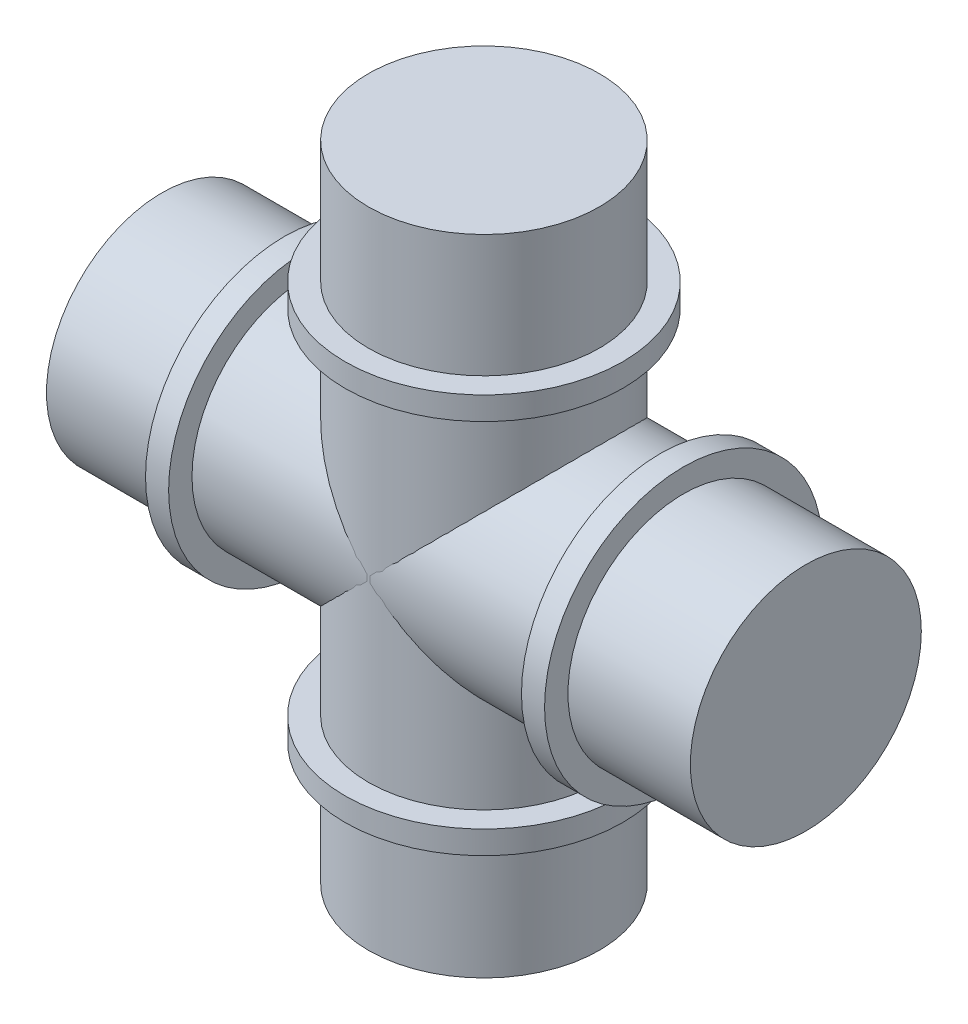
ISO-10303-21;
HEADER;
FILE_DESCRIPTION(('STEP AP214'),'2;1');
FILE_NAME('part.step','',(''),(''),'','','');
FILE_SCHEMA(('AUTOMOTIVE_DESIGN { 1 0 10303 214 1 1 1 1 }'));
ENDSEC;
DATA;
#1=APPLICATION_CONTEXT('core data for automotive mechanical design processes');
#2=APPLICATION_PROTOCOL_DEFINITION('international standard','automotive_design',2000,#1);
#3=PRODUCT_CONTEXT('',#1,'mechanical');
#4=PRODUCT('Part','Part','',(#3));
#5=PRODUCT_RELATED_PRODUCT_CATEGORY('part','',(#4));
#6=PRODUCT_DEFINITION_FORMATION('','',#4);
#7=PRODUCT_DEFINITION_CONTEXT('part definition',#1,'design');
#8=PRODUCT_DEFINITION('design','',#6,#7);
#9=PRODUCT_DEFINITION_SHAPE('','',#8);
#10=(LENGTH_UNIT() NAMED_UNIT(*) SI_UNIT(.MILLI.,.METRE.));
#11=(NAMED_UNIT(*) PLANE_ANGLE_UNIT() SI_UNIT($,.RADIAN.));
#12=(NAMED_UNIT(*) SI_UNIT($,.STERADIAN.) SOLID_ANGLE_UNIT());
#13=UNCERTAINTY_MEASURE_WITH_UNIT(LENGTH_MEASURE(1.E-05),#10,'distance_accuracy_value','');
#14=(GEOMETRIC_REPRESENTATION_CONTEXT(3) GLOBAL_UNCERTAINTY_ASSIGNED_CONTEXT((#13)) GLOBAL_UNIT_ASSIGNED_CONTEXT((#10,
#11,#12)) REPRESENTATION_CONTEXT('',''));
#15=CARTESIAN_POINT('',(0.,0.,0.));
#16=DIRECTION('',(0.,0.,1.));
#17=DIRECTION('',(1.,0.,0.));
#18=AXIS2_PLACEMENT_3D('',#15,#16,#17);
#19=CARTESIAN_POINT('',(-177.,127.,0.));
#20=DIRECTION('',(1.,0.,0.));
#21=DIRECTION('',(0.,0.,-1.));
#22=AXIS2_PLACEMENT_3D('',#19,#20,#21);
#23=CYLINDRICAL_SURFACE('',#22,63.5);
#24=CARTESIAN_POINT('',(97.,127.,0.));
#25=DIRECTION('',(1.,0.,0.));
#26=DIRECTION('',(0.,0.,-1.));
#27=AXIS2_PLACEMENT_3D('',#24,#25,#26);
#28=CIRCLE('',#27,63.5);
#29=CARTESIAN_POINT('',(97.,127.,-63.5));
#30=VERTEX_POINT('',#29);
#31=EDGE_CURVE('E68',#30,#30,#28,.T.);
#32=ORIENTED_EDGE('',*,*,#31,.F.);
#33=EDGE_LOOP('',(#32));
#34=FACE_BOUND('',#33,.T.);
#35=CARTESIAN_POINT('',(-97.,127.,0.));
#36=DIRECTION('',(-1.,0.,0.));
#37=DIRECTION('',(0.,0.,1.));
#38=AXIS2_PLACEMENT_3D('',#35,#36,#37);
#39=CIRCLE('',#38,63.5);
#40=CARTESIAN_POINT('',(-97.,127.,63.5));
#41=VERTEX_POINT('',#40);
#42=EDGE_CURVE('E77',#41,#41,#39,.T.);
#43=ORIENTED_EDGE('',*,*,#42,.F.);
#44=EDGE_LOOP('',(#43));
#45=FACE_BOUND('',#44,.T.);
#46=ADVANCED_FACE('F44',(#34,#45),#23,.T.);
#47=CARTESIAN_POINT('',(109.7,127.,0.));
#48=DIRECTION('',(1.,0.,0.));
#49=DIRECTION('',(0.,0.,-1.));
#50=AXIS2_PLACEMENT_3D('',#47,#48,#49);
#51=CIRCLE('',#50,63.5);
#52=CARTESIAN_POINT('',(109.7,127.,-63.5));
#53=VERTEX_POINT('',#52);
#54=EDGE_CURVE('E51',#53,#53,#51,.F.);
#55=ORIENTED_EDGE('',*,*,#54,.F.);
#56=EDGE_LOOP('',(#55));
#57=FACE_BOUND('',#56,.T.);
#58=CARTESIAN_POINT('',(177.,127.,0.));
#59=DIRECTION('',(1.,0.,0.));
#60=DIRECTION('',(0.,0.,-1.));
#61=AXIS2_PLACEMENT_3D('',#58,#59,#60);
#62=CIRCLE('',#61,63.5);
#63=CARTESIAN_POINT('',(177.,127.,-63.5));
#64=VERTEX_POINT('',#63);
#65=EDGE_CURVE('E59',#64,#64,#62,.T.);
#66=ORIENTED_EDGE('',*,*,#65,.F.);
#67=EDGE_LOOP('',(#66));
#68=FACE_BOUND('',#67,.T.);
#69=ADVANCED_FACE('F46',(#57,#68),#23,.T.);
#70=CARTESIAN_POINT('',(177.,0.,0.));
#71=DIRECTION('',(1.,0.,0.));
#72=DIRECTION('',(0.,0.,-1.));
#73=AXIS2_PLACEMENT_3D('',#70,#71,#72);
#74=PLANE('',#73);
#75=ORIENTED_EDGE('',*,*,#65,.T.);
#76=EDGE_LOOP('',(#75));
#77=FACE_BOUND('',#76,.T.);
#78=ADVANCED_FACE('F91',(#77),#74,.T.);
#79=CARTESIAN_POINT('',(109.7,127.,0.));
#80=DIRECTION('',(1.,0.,0.));
#81=DIRECTION('',(0.,0.,-1.));
#82=AXIS2_PLACEMENT_3D('',#79,#80,#81);
#83=PLANE('',#82);
#84=CARTESIAN_POINT('',(109.7,127.,0.));
#85=DIRECTION('',(1.,0.,0.));
#86=DIRECTION('',(0.,0.,-1.));
#87=AXIS2_PLACEMENT_3D('',#84,#85,#86);
#88=CIRCLE('',#87,76.35);
#89=CARTESIAN_POINT('',(109.7,127.,-76.35));
#90=VERTEX_POINT('',#89);
#91=EDGE_CURVE('E64',#90,#90,#88,.T.);
#92=ORIENTED_EDGE('',*,*,#91,.T.);
#93=EDGE_LOOP('',(#92));
#94=FACE_BOUND('',#93,.T.);
#95=ORIENTED_EDGE('',*,*,#54,.T.);
#96=EDGE_LOOP('',(#95));
#97=FACE_BOUND('',#96,.T.);
#98=ADVANCED_FACE('F112',(#94,#97),#83,.T.);
#99=CARTESIAN_POINT('',(97.,127.,0.));
#100=DIRECTION('',(1.,0.,0.));
#101=DIRECTION('',(0.,0.,-1.));
#102=AXIS2_PLACEMENT_3D('',#99,#100,#101);
#103=PLANE('',#102);
#104=CARTESIAN_POINT('',(97.,127.,0.));
#105=DIRECTION('',(1.,0.,0.));
#106=DIRECTION('',(0.,0.,-1.));
#107=AXIS2_PLACEMENT_3D('',#104,#105,#106);
#108=CIRCLE('',#107,76.35);
#109=CARTESIAN_POINT('',(97.,127.,-76.35));
#110=VERTEX_POINT('',#109);
#111=EDGE_CURVE('E65',#110,#110,#108,.T.);
#112=ORIENTED_EDGE('',*,*,#111,.F.);
#113=EDGE_LOOP('',(#112));
#114=FACE_BOUND('',#113,.T.);
#115=ORIENTED_EDGE('',*,*,#31,.T.);
#116=EDGE_LOOP('',(#115));
#117=FACE_BOUND('',#116,.T.);
#118=ADVANCED_FACE('F118',(#114,#117),#103,.F.);
#119=CARTESIAN_POINT('',(109.7,127.,0.));
#120=DIRECTION('',(-1.,0.,0.));
#121=DIRECTION('',(0.,0.,1.));
#122=AXIS2_PLACEMENT_3D('',#119,#120,#121);
#123=CYLINDRICAL_SURFACE('',#122,76.35);
#124=ORIENTED_EDGE('',*,*,#91,.F.);
#125=EDGE_LOOP('',(#124));
#126=FACE_BOUND('',#125,.T.);
#127=ORIENTED_EDGE('',*,*,#111,.T.);
#128=EDGE_LOOP('',(#127));
#129=FACE_BOUND('',#128,.T.);
#130=ADVANCED_FACE('F114',(#126,#129),#123,.T.);
#131=CARTESIAN_POINT('',(-109.7,127.,0.));
#132=DIRECTION('',(-1.,0.,0.));
#133=DIRECTION('',(0.,0.,1.));
#134=AXIS2_PLACEMENT_3D('',#131,#132,#133);
#135=PLANE('',#134);
#136=CARTESIAN_POINT('',(-109.7,127.,0.));
#137=DIRECTION('',(-1.,0.,0.));
#138=DIRECTION('',(0.,0.,1.));
#139=AXIS2_PLACEMENT_3D('',#136,#137,#138);
#140=CIRCLE('',#139,76.35);
#141=CARTESIAN_POINT('',(-109.7,127.,76.35));
#142=VERTEX_POINT('',#141);
#143=EDGE_CURVE('E73',#142,#142,#140,.T.);
#144=ORIENTED_EDGE('',*,*,#143,.T.);
#145=EDGE_LOOP('',(#144));
#146=FACE_BOUND('',#145,.T.);
#147=CARTESIAN_POINT('',(-109.7,127.,0.));
#148=DIRECTION('',(-1.,0.,0.));
#149=DIRECTION('',(0.,0.,1.));
#150=AXIS2_PLACEMENT_3D('',#147,#148,#149);
#151=CIRCLE('',#150,63.5);
#152=CARTESIAN_POINT('',(-109.7,127.,63.5));
#153=VERTEX_POINT('',#152);
#154=EDGE_CURVE('E11',#153,#153,#151,.F.);
#155=ORIENTED_EDGE('',*,*,#154,.T.);
#156=EDGE_LOOP('',(#155));
#157=FACE_BOUND('',#156,.T.);
#158=ADVANCED_FACE('F117',(#146,#157),#135,.T.);
#159=CARTESIAN_POINT('',(-97.,127.,0.));
#160=DIRECTION('',(-1.,0.,0.));
#161=DIRECTION('',(0.,0.,1.));
#162=AXIS2_PLACEMENT_3D('',#159,#160,#161);
#163=PLANE('',#162);
#164=CARTESIAN_POINT('',(-97.,127.,0.));
#165=DIRECTION('',(-1.,0.,0.));
#166=DIRECTION('',(0.,0.,1.));
#167=AXIS2_PLACEMENT_3D('',#164,#165,#166);
#168=CIRCLE('',#167,76.35);
#169=CARTESIAN_POINT('',(-97.,127.,76.35));
#170=VERTEX_POINT('',#169);
#171=EDGE_CURVE('E74',#170,#170,#168,.T.);
#172=ORIENTED_EDGE('',*,*,#171,.F.);
#173=EDGE_LOOP('',(#172));
#174=FACE_BOUND('',#173,.T.);
#175=ORIENTED_EDGE('',*,*,#42,.T.);
#176=EDGE_LOOP('',(#175));
#177=FACE_BOUND('',#176,.T.);
#178=ADVANCED_FACE('F83',(#174,#177),#163,.F.);
#179=CARTESIAN_POINT('',(-109.7,127.,0.));
#180=DIRECTION('',(1.,0.,0.));
#181=DIRECTION('',(0.,0.,-1.));
#182=AXIS2_PLACEMENT_3D('',#179,#180,#181);
#183=CYLINDRICAL_SURFACE('',#182,76.35);
#184=ORIENTED_EDGE('',*,*,#143,.F.);
#185=EDGE_LOOP('',(#184));
#186=FACE_BOUND('',#185,.T.);
#187=ORIENTED_EDGE('',*,*,#171,.T.);
#188=EDGE_LOOP('',(#187));
#189=FACE_BOUND('',#188,.T.);
#190=ADVANCED_FACE('F100',(#186,#189),#183,.T.);
#191=CARTESIAN_POINT('',(-177.,0.,0.));
#192=DIRECTION('',(1.,0.,0.));
#193=DIRECTION('',(0.,0.,-1.));
#194=AXIS2_PLACEMENT_3D('',#191,#192,#193);
#195=PLANE('',#194);
#196=CARTESIAN_POINT('',(-177.,127.,0.));
#197=DIRECTION('',(1.,0.,0.));
#198=DIRECTION('',(0.,0.,-1.));
#199=AXIS2_PLACEMENT_3D('',#196,#197,#198);
#200=CIRCLE('',#199,63.5);
#201=CARTESIAN_POINT('',(-177.,127.,-63.5));
#202=VERTEX_POINT('',#201);
#203=EDGE_CURVE('E55',#202,#202,#200,.T.);
#204=ORIENTED_EDGE('',*,*,#203,.F.);
#205=EDGE_LOOP('',(#204));
#206=FACE_BOUND('',#205,.T.);
#207=ADVANCED_FACE('F95',(#206),#195,.F.);
#208=ORIENTED_EDGE('',*,*,#154,.F.);
#209=EDGE_LOOP('',(#208));
#210=FACE_BOUND('',#209,.T.);
#211=ORIENTED_EDGE('',*,*,#203,.T.);
#212=EDGE_LOOP('',(#211));
#213=FACE_BOUND('',#212,.T.);
#214=ADVANCED_FACE('F87',(#210,#213),#23,.T.);
#215=CLOSED_SHELL('',(#46,#69,#78,#98,#118,#130,#158,#178,#190,#207,#214));
#216=MANIFOLD_SOLID_BREP('B2',#215);
#217=CARTESIAN_POINT('',(0.,-50.,0.));
#218=DIRECTION('',(0.,1.,0.));
#219=DIRECTION('',(0.,0.,1.));
#220=AXIS2_PLACEMENT_3D('',#217,#218,#219);
#221=CYLINDRICAL_SURFACE('',#220,63.5);
#222=CARTESIAN_POINT('',(0.,30.,0.));
#223=DIRECTION('',(0.,-1.,0.));
#224=DIRECTION('',(0.,0.,-1.));
#225=AXIS2_PLACEMENT_3D('',#222,#223,#224);
#226=CIRCLE('',#225,63.5);
#227=CARTESIAN_POINT('',(0.,30.,-63.5));
#228=VERTEX_POINT('',#227);
#229=EDGE_CURVE('E221',#228,#228,#226,.F.);
#230=ORIENTED_EDGE('',*,*,#229,.T.);
#231=EDGE_LOOP('',(#230));
#232=FACE_BOUND('',#231,.T.);
#233=CARTESIAN_POINT('',(0.,224.,0.));
#234=DIRECTION('',(0.,1.,0.));
#235=DIRECTION('',(0.,0.,1.));
#236=AXIS2_PLACEMENT_3D('',#233,#234,#235);
#237=CIRCLE('',#236,63.5);
#238=CARTESIAN_POINT('',(0.,224.,63.5));
#239=VERTEX_POINT('',#238);
#240=EDGE_CURVE('E222',#239,#239,#237,.F.);
#241=ORIENTED_EDGE('',*,*,#240,.T.);
#242=EDGE_LOOP('',(#241));
#243=FACE_BOUND('',#242,.T.);
#244=ADVANCED_FACE('F202',(#232,#243),#221,.T.);
#245=CARTESIAN_POINT('',(0.,17.3,0.));
#246=DIRECTION('',(0.,-1.,0.));
#247=DIRECTION('',(0.,0.,-1.));
#248=AXIS2_PLACEMENT_3D('',#245,#246,#247);
#249=CIRCLE('',#248,63.5);
#250=CARTESIAN_POINT('',(0.,17.3,-63.5));
#251=VERTEX_POINT('',#250);
#252=EDGE_CURVE('E209',#251,#251,#249,.F.);
#253=ORIENTED_EDGE('',*,*,#252,.F.);
#254=EDGE_LOOP('',(#253));
#255=FACE_BOUND('',#254,.T.);
#256=CARTESIAN_POINT('',(0.,-50.,0.));
#257=DIRECTION('',(0.,1.,0.));
#258=DIRECTION('',(0.,0.,1.));
#259=AXIS2_PLACEMENT_3D('',#256,#257,#258);
#260=CIRCLE('',#259,63.5);
#261=CARTESIAN_POINT('',(0.,-50.,63.5));
#262=VERTEX_POINT('',#261);
#263=EDGE_CURVE('E213',#262,#262,#260,.T.);
#264=ORIENTED_EDGE('',*,*,#263,.T.);
#265=EDGE_LOOP('',(#264));
#266=FACE_BOUND('',#265,.T.);
#267=ADVANCED_FACE('F204',(#255,#266),#221,.T.);
#268=CARTESIAN_POINT('',(0.,-50.,0.));
#269=DIRECTION('',(0.,1.,0.));
#270=DIRECTION('',(0.,0.,1.));
#271=AXIS2_PLACEMENT_3D('',#268,#269,#270);
#272=PLANE('',#271);
#273=ORIENTED_EDGE('',*,*,#263,.F.);
#274=EDGE_LOOP('',(#273));
#275=FACE_BOUND('',#274,.T.);
#276=ADVANCED_FACE('F258',(#275),#272,.F.);
#277=CARTESIAN_POINT('',(0.,17.3,0.));
#278=DIRECTION('',(0.,1.,0.));
#279=DIRECTION('',(0.,0.,1.));
#280=AXIS2_PLACEMENT_3D('',#277,#278,#279);
#281=CYLINDRICAL_SURFACE('',#280,76.35);
#282=CARTESIAN_POINT('',(0.,17.3,0.));
#283=DIRECTION('',(0.,-1.,0.));
#284=DIRECTION('',(0.,0.,-1.));
#285=AXIS2_PLACEMENT_3D('',#282,#283,#284);
#286=CIRCLE('',#285,76.35);
#287=CARTESIAN_POINT('',(0.,17.3,-76.35));
#288=VERTEX_POINT('',#287);
#289=EDGE_CURVE('E229',#288,#288,#286,.T.);
#290=ORIENTED_EDGE('',*,*,#289,.F.);
#291=EDGE_LOOP('',(#290));
#292=FACE_BOUND('',#291,.T.);
#293=CARTESIAN_POINT('',(0.,30.,0.));
#294=DIRECTION('',(0.,-1.,0.));
#295=DIRECTION('',(0.,0.,-1.));
#296=AXIS2_PLACEMENT_3D('',#293,#294,#295);
#297=CIRCLE('',#296,76.35);
#298=CARTESIAN_POINT('',(0.,30.,-76.35));
#299=VERTEX_POINT('',#298);
#300=EDGE_CURVE('E224',#299,#299,#297,.T.);
#301=ORIENTED_EDGE('',*,*,#300,.T.);
#302=EDGE_LOOP('',(#301));
#303=FACE_BOUND('',#302,.T.);
#304=ADVANCED_FACE('F256',(#292,#303),#281,.T.);
#305=CARTESIAN_POINT('',(0.,17.3,0.));
#306=DIRECTION('',(0.,-1.,0.));
#307=DIRECTION('',(0.,0.,-1.));
#308=AXIS2_PLACEMENT_3D('',#305,#306,#307);
#309=PLANE('',#308);
#310=ORIENTED_EDGE('',*,*,#252,.T.);
#311=EDGE_LOOP('',(#310));
#312=FACE_BOUND('',#311,.T.);
#313=ORIENTED_EDGE('',*,*,#289,.T.);
#314=EDGE_LOOP('',(#313));
#315=FACE_BOUND('',#314,.T.);
#316=ADVANCED_FACE('F252',(#312,#315),#309,.T.);
#317=CARTESIAN_POINT('',(0.,30.,0.));
#318=DIRECTION('',(0.,-1.,0.));
#319=DIRECTION('',(0.,0.,-1.));
#320=AXIS2_PLACEMENT_3D('',#317,#318,#319);
#321=PLANE('',#320);
#322=ORIENTED_EDGE('',*,*,#229,.F.);
#323=EDGE_LOOP('',(#322));
#324=FACE_BOUND('',#323,.T.);
#325=ORIENTED_EDGE('',*,*,#300,.F.);
#326=EDGE_LOOP('',(#325));
#327=FACE_BOUND('',#326,.T.);
#328=ADVANCED_FACE('F248',(#324,#327),#321,.F.);
#329=CARTESIAN_POINT('',(0.,236.7,0.));
#330=DIRECTION('',(0.,-1.,0.));
#331=DIRECTION('',(0.,0.,-1.));
#332=AXIS2_PLACEMENT_3D('',#329,#330,#331);
#333=CYLINDRICAL_SURFACE('',#332,76.35);
#334=CARTESIAN_POINT('',(0.,236.7,0.));
#335=DIRECTION('',(0.,1.,0.));
#336=DIRECTION('',(0.,0.,1.));
#337=AXIS2_PLACEMENT_3D('',#334,#335,#336);
#338=CIRCLE('',#337,76.35);
#339=CARTESIAN_POINT('',(0.,236.7,76.35));
#340=VERTEX_POINT('',#339);
#341=EDGE_CURVE('E225',#340,#340,#338,.T.);
#342=ORIENTED_EDGE('',*,*,#341,.F.);
#343=EDGE_LOOP('',(#342));
#344=FACE_BOUND('',#343,.T.);
#345=CARTESIAN_POINT('',(0.,224.,0.));
#346=DIRECTION('',(0.,1.,0.));
#347=DIRECTION('',(0.,0.,1.));
#348=AXIS2_PLACEMENT_3D('',#345,#346,#347);
#349=CIRCLE('',#348,76.35);
#350=CARTESIAN_POINT('',(0.,224.,76.35));
#351=VERTEX_POINT('',#350);
#352=EDGE_CURVE('E232',#351,#351,#349,.T.);
#353=ORIENTED_EDGE('',*,*,#352,.T.);
#354=EDGE_LOOP('',(#353));
#355=FACE_BOUND('',#354,.T.);
#356=ADVANCED_FACE('F251',(#344,#355),#333,.T.);
#357=CARTESIAN_POINT('',(0.,236.7,0.));
#358=DIRECTION('',(0.,1.,0.));
#359=DIRECTION('',(0.,0.,1.));
#360=AXIS2_PLACEMENT_3D('',#357,#358,#359);
#361=PLANE('',#360);
#362=CARTESIAN_POINT('',(0.,236.7,0.));
#363=DIRECTION('',(0.,1.,0.));
#364=DIRECTION('',(0.,0.,1.));
#365=AXIS2_PLACEMENT_3D('',#362,#363,#364);
#366=CIRCLE('',#365,63.5);
#367=CARTESIAN_POINT('',(0.,236.7,63.5));
#368=VERTEX_POINT('',#367);
#369=EDGE_CURVE('E43',#368,#368,#366,.F.);
#370=ORIENTED_EDGE('',*,*,#369,.T.);
#371=EDGE_LOOP('',(#370));
#372=FACE_BOUND('',#371,.T.);
#373=ORIENTED_EDGE('',*,*,#341,.T.);
#374=EDGE_LOOP('',(#373));
#375=FACE_BOUND('',#374,.T.);
#376=ADVANCED_FACE('F286',(#372,#375),#361,.T.);
#377=CARTESIAN_POINT('',(0.,224.,0.));
#378=DIRECTION('',(0.,1.,0.));
#379=DIRECTION('',(0.,0.,1.));
#380=AXIS2_PLACEMENT_3D('',#377,#378,#379);
#381=PLANE('',#380);
#382=ORIENTED_EDGE('',*,*,#240,.F.);
#383=EDGE_LOOP('',(#382));
#384=FACE_BOUND('',#383,.T.);
#385=ORIENTED_EDGE('',*,*,#352,.F.);
#386=EDGE_LOOP('',(#385));
#387=FACE_BOUND('',#386,.T.);
#388=ADVANCED_FACE('F281',(#384,#387),#381,.F.);
#389=CARTESIAN_POINT('',(0.,304.,0.));
#390=DIRECTION('',(0.,1.,0.));
#391=DIRECTION('',(0.,0.,1.));
#392=AXIS2_PLACEMENT_3D('',#389,#390,#391);
#393=PLANE('',#392);
#394=CARTESIAN_POINT('',(0.,304.,0.));
#395=DIRECTION('',(0.,1.,0.));
#396=DIRECTION('',(0.,0.,1.));
#397=AXIS2_PLACEMENT_3D('',#394,#395,#396);
#398=CIRCLE('',#397,63.5);
#399=CARTESIAN_POINT('',(0.,304.,63.5));
#400=VERTEX_POINT('',#399);
#401=EDGE_CURVE('E218',#400,#400,#398,.T.);
#402=ORIENTED_EDGE('',*,*,#401,.T.);
#403=EDGE_LOOP('',(#402));
#404=FACE_BOUND('',#403,.T.);
#405=ADVANCED_FACE('F276',(#404),#393,.T.);
#406=ORIENTED_EDGE('',*,*,#369,.F.);
#407=EDGE_LOOP('',(#406));
#408=FACE_BOUND('',#407,.T.);
#409=ORIENTED_EDGE('',*,*,#401,.F.);
#410=EDGE_LOOP('',(#409));
#411=FACE_BOUND('',#410,.T.);
#412=ADVANCED_FACE('F270',(#408,#411),#221,.T.);
#413=CLOSED_SHELL('',(#244,#267,#276,#304,#316,#328,#356,#376,#388,#405,#412));
#414=MANIFOLD_SOLID_BREP('B6',#413);
#415=ADVANCED_BREP_SHAPE_REPRESENTATION('',(#18,#216,#414),#14);
#416=SHAPE_DEFINITION_REPRESENTATION(#9,#415);
ENDSEC;
END-ISO-10303-21;
